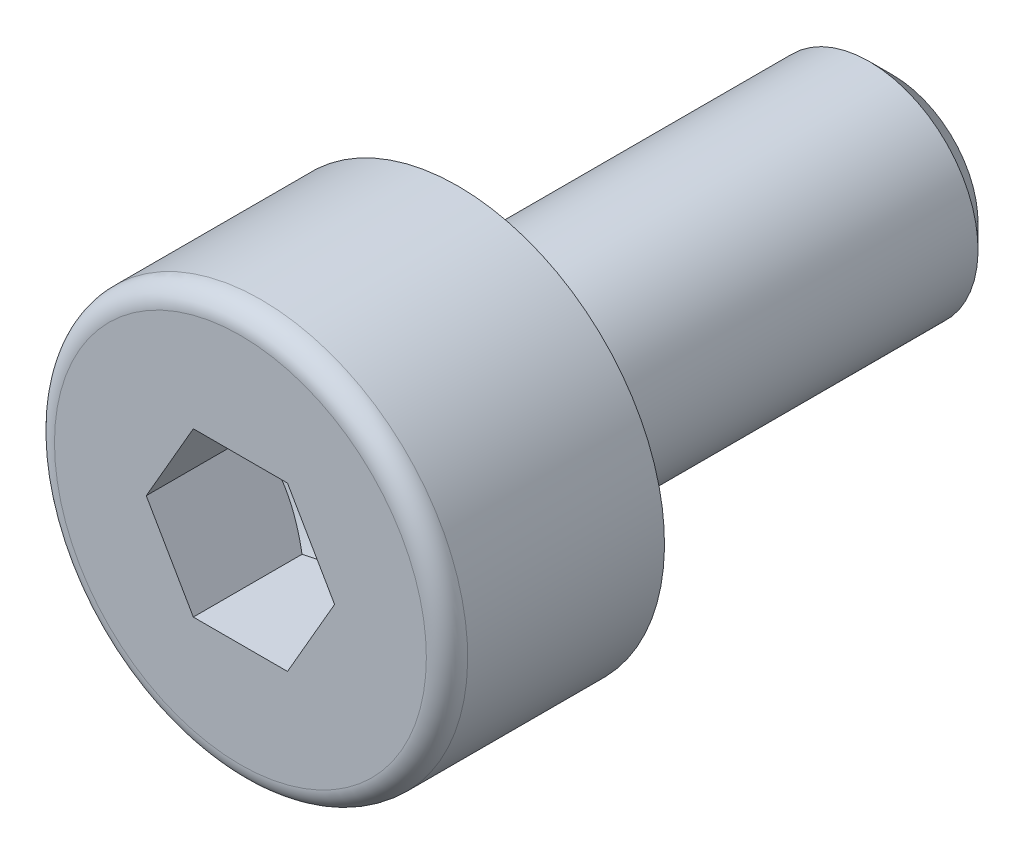
ISO-10303-21;
HEADER;
FILE_DESCRIPTION(('STEP AP214'),'2;1');
FILE_NAME('part.step','',(''),(''),'','','');
FILE_SCHEMA(('AUTOMOTIVE_DESIGN { 1 0 10303 214 1 1 1 1 }'));
ENDSEC;
DATA;
#1=APPLICATION_CONTEXT('core data for automotive mechanical design processes');
#2=APPLICATION_PROTOCOL_DEFINITION('international standard','automotive_design',2000,#1);
#3=PRODUCT_CONTEXT('',#1,'mechanical');
#4=PRODUCT('Part','Part','',(#3));
#5=PRODUCT_RELATED_PRODUCT_CATEGORY('part','',(#4));
#6=PRODUCT_DEFINITION_FORMATION('','',#4);
#7=PRODUCT_DEFINITION_CONTEXT('part definition',#1,'design');
#8=PRODUCT_DEFINITION('design','',#6,#7);
#9=PRODUCT_DEFINITION_SHAPE('','',#8);
#10=(LENGTH_UNIT() NAMED_UNIT(*) SI_UNIT(.MILLI.,.METRE.));
#11=(NAMED_UNIT(*) PLANE_ANGLE_UNIT() SI_UNIT($,.RADIAN.));
#12=(NAMED_UNIT(*) SI_UNIT($,.STERADIAN.) SOLID_ANGLE_UNIT());
#13=UNCERTAINTY_MEASURE_WITH_UNIT(LENGTH_MEASURE(1.E-05),#10,'distance_accuracy_value','');
#14=(GEOMETRIC_REPRESENTATION_CONTEXT(3) GLOBAL_UNCERTAINTY_ASSIGNED_CONTEXT((#13)) GLOBAL_UNIT_ASSIGNED_CONTEXT((#10,
#11,#12)) REPRESENTATION_CONTEXT('',''));
#15=CARTESIAN_POINT('',(0.,0.,0.));
#16=DIRECTION('',(0.,0.,1.));
#17=DIRECTION('',(1.,0.,0.));
#18=AXIS2_PLACEMENT_3D('',#15,#16,#17);
#19=CARTESIAN_POINT('',(0.,0.95,0.));
#20=DIRECTION('',(0.,0.,-1.));
#21=DIRECTION('',(0.,1.,0.));
#22=AXIS2_PLACEMENT_3D('',#19,#20,#21);
#23=PLANE('',#22);
#24=CARTESIAN_POINT('',(0.,0.,0.));
#25=DIRECTION('',(0.,0.,-1.));
#26=DIRECTION('',(0.,1.,0.));
#27=AXIS2_PLACEMENT_3D('',#24,#25,#26);
#28=CIRCLE('',#27,1.9);
#29=CARTESIAN_POINT('',(0.,1.9,0.));
#30=VERTEX_POINT('',#29);
#31=EDGE_CURVE('E11',#30,#30,#28,.T.);
#32=ORIENTED_EDGE('',*,*,#31,.T.);
#33=EDGE_LOOP('',(#32));
#34=FACE_BOUND('',#33,.T.);
#35=CARTESIAN_POINT('',(0.,0.,0.));
#36=DIRECTION('',(0.,0.,1.));
#37=DIRECTION('',(0.,1.,0.));
#38=AXIS2_PLACEMENT_3D('',#35,#36,#37);
#39=CIRCLE('',#38,1.);
#40=CARTESIAN_POINT('',(0.,-1.,0.));
#41=VERTEX_POINT('',#40);
#42=EDGE_CURVE('E83',#41,#41,#39,.T.);
#43=ORIENTED_EDGE('',*,*,#42,.T.);
#44=EDGE_LOOP('',(#43));
#45=FACE_BOUND('',#44,.T.);
#46=ADVANCED_FACE('F16',(#34,#45),#23,.T.);
#47=CARTESIAN_POINT('',(0.,0.,0.905));
#48=DIRECTION('',(0.,0.,1.));
#49=DIRECTION('',(0.,1.,0.));
#50=AXIS2_PLACEMENT_3D('',#47,#48,#49);
#51=CYLINDRICAL_SURFACE('',#50,1.9);
#52=CARTESIAN_POINT('',(0.,0.,1.81));
#53=DIRECTION('',(0.,0.,-1.));
#54=DIRECTION('',(0.,1.,0.));
#55=AXIS2_PLACEMENT_3D('',#52,#53,#54);
#56=CIRCLE('',#55,1.9);
#57=CARTESIAN_POINT('',(0.,1.9,1.81));
#58=VERTEX_POINT('',#57);
#59=EDGE_CURVE('E28',#58,#58,#56,.T.);
#60=ORIENTED_EDGE('',*,*,#59,.T.);
#61=EDGE_LOOP('',(#60));
#62=FACE_BOUND('',#61,.T.);
#63=ORIENTED_EDGE('',*,*,#31,.F.);
#64=EDGE_LOOP('',(#63));
#65=FACE_BOUND('',#64,.T.);
#66=ADVANCED_FACE('F209',(#62,#65),#51,.T.);
#67=CARTESIAN_POINT('',(0.,0.,1.81));
#68=DIRECTION('',(0.,0.,-1.));
#69=DIRECTION('',(-1.,0.,0.));
#70=AXIS2_PLACEMENT_3D('',#67,#68,#69);
#71=TOROIDAL_SURFACE('',#70,1.71,0.19);
#72=CARTESIAN_POINT('',(0.,0.,2.));
#73=DIRECTION('',(0.,0.,-1.));
#74=DIRECTION('',(0.,1.,0.));
#75=AXIS2_PLACEMENT_3D('',#72,#73,#74);
#76=CIRCLE('',#75,1.71);
#77=CARTESIAN_POINT('',(0.,1.71,2.));
#78=VERTEX_POINT('',#77);
#79=EDGE_CURVE('E75',#78,#78,#76,.T.);
#80=ORIENTED_EDGE('',*,*,#79,.T.);
#81=EDGE_LOOP('',(#80));
#82=FACE_BOUND('',#81,.T.);
#83=ORIENTED_EDGE('',*,*,#59,.F.);
#84=EDGE_LOOP('',(#83));
#85=FACE_BOUND('',#84,.T.);
#86=ADVANCED_FACE('F213',(#82,#85),#71,.T.);
#87=CARTESIAN_POINT('',(0.,0.855,2.));
#88=DIRECTION('',(0.,0.,1.));
#89=DIRECTION('',(0.,-1.,0.));
#90=AXIS2_PLACEMENT_3D('',#87,#88,#89);
#91=PLANE('',#90);
#92=ORIENTED_EDGE('',*,*,#79,.F.);
#93=EDGE_LOOP('',(#92));
#94=FACE_BOUND('',#93,.T.);
#95=DIRECTION('',(-0.5,0.866025403784439,0.));
#96=VECTOR('',#95,1.);
#97=CARTESIAN_POINT('',(-0.834631680058924,-0.0543748251562093,2.));
#98=LINE('',#97,#96);
#99=CARTESIAN_POINT('',(-0.4330125,-0.749999650312419,2.));
#100=VERTEX_POINT('',#99);
#101=CARTESIAN_POINT('',(-0.866025,0.,2.));
#102=VERTEX_POINT('',#101);
#103=EDGE_CURVE('E147',#100,#102,#98,.T.);
#104=ORIENTED_EDGE('',*,*,#103,.T.);
#105=DIRECTION('',(0.5,0.866025403784439,0.));
#106=VECTOR('',#105,1.);
#107=CARTESIAN_POINT('',(-0.464405819941077,0.695624825156209,2.));
#108=LINE('',#107,#106);
#109=CARTESIAN_POINT('',(-0.4330125,0.749999650312418,2.));
#110=VERTEX_POINT('',#109);
#111=EDGE_CURVE('E62',#102,#110,#108,.T.);
#112=ORIENTED_EDGE('',*,*,#111,.T.);
#113=DIRECTION('',(1.,0.,0.));
#114=VECTOR('',#113,1.);
#115=CARTESIAN_POINT('',(0.,0.749999650312419,2.));
#116=LINE('',#115,#114);
#117=CARTESIAN_POINT('',(0.4330125,0.749999650312419,2.));
#118=VERTEX_POINT('',#117);
#119=EDGE_CURVE('E67',#110,#118,#116,.T.);
#120=ORIENTED_EDGE('',*,*,#119,.T.);
#121=DIRECTION('',(0.5,-0.866025403784439,0.));
#122=VECTOR('',#121,1.);
#123=CARTESIAN_POINT('',(0.464405819941076,0.695624825156209,2.));
#124=LINE('',#123,#122);
#125=CARTESIAN_POINT('',(0.866025,0.,2.));
#126=VERTEX_POINT('',#125);
#127=EDGE_CURVE('E134',#118,#126,#124,.T.);
#128=ORIENTED_EDGE('',*,*,#127,.T.);
#129=DIRECTION('',(-0.5,-0.866025403784439,0.));
#130=VECTOR('',#129,1.);
#131=CARTESIAN_POINT('',(0.834631680058924,-0.0543748251562093,2.));
#132=LINE('',#131,#130);
#133=CARTESIAN_POINT('',(0.4330125,-0.749999650312419,2.));
#134=VERTEX_POINT('',#133);
#135=EDGE_CURVE('E113',#126,#134,#132,.T.);
#136=ORIENTED_EDGE('',*,*,#135,.T.);
#137=DIRECTION('',(-1.,0.,0.));
#138=VECTOR('',#137,1.);
#139=CARTESIAN_POINT('',(0.,-0.749999650312419,2.));
#140=LINE('',#139,#138);
#141=EDGE_CURVE('E110',#134,#100,#140,.T.);
#142=ORIENTED_EDGE('',*,*,#141,.T.);
#143=EDGE_LOOP('',(#104,#112,#120,#128,#136,#142));
#144=FACE_BOUND('',#143,.T.);
#145=ADVANCED_FACE('F184',(#94,#144),#91,.T.);
#146=CARTESIAN_POINT('',(0.,0.39175,-4.));
#147=DIRECTION('',(0.,0.,-1.));
#148=DIRECTION('',(0.,1.,0.));
#149=AXIS2_PLACEMENT_3D('',#146,#147,#148);
#150=PLANE('',#149);
#151=CARTESIAN_POINT('',(0.,0.,-4.));
#152=DIRECTION('',(0.,0.,-1.));
#153=DIRECTION('',(0.,1.,0.));
#154=AXIS2_PLACEMENT_3D('',#151,#152,#153);
#155=CIRCLE('',#154,0.7835);
#156=CARTESIAN_POINT('',(0.,0.7835,-4.));
#157=VERTEX_POINT('',#156);
#158=EDGE_CURVE('E79',#157,#157,#155,.T.);
#159=ORIENTED_EDGE('',*,*,#158,.T.);
#160=EDGE_LOOP('',(#159));
#161=FACE_BOUND('',#160,.T.);
#162=ADVANCED_FACE('F220',(#161),#150,.T.);
#163=CARTESIAN_POINT('',(0.,0.,-3.89175));
#164=DIRECTION('',(0.,0.,1.));
#165=DIRECTION('',(0.,1.,0.));
#166=AXIS2_PLACEMENT_3D('',#163,#164,#165);
#167=CONICAL_SURFACE('',#166,0.89175,0.785398163397449);
#168=CARTESIAN_POINT('',(0.,0.,-3.7835));
#169=DIRECTION('',(0.,0.,-1.));
#170=DIRECTION('',(0.,1.,0.));
#171=AXIS2_PLACEMENT_3D('',#168,#169,#170);
#172=CIRCLE('',#171,1.);
#173=CARTESIAN_POINT('',(0.,1.,-3.7835));
#174=VERTEX_POINT('',#173);
#175=EDGE_CURVE('E141',#174,#174,#172,.T.);
#176=ORIENTED_EDGE('',*,*,#175,.T.);
#177=EDGE_LOOP('',(#176));
#178=FACE_BOUND('',#177,.T.);
#179=ORIENTED_EDGE('',*,*,#158,.F.);
#180=EDGE_LOOP('',(#179));
#181=FACE_BOUND('',#180,.T.);
#182=ADVANCED_FACE('F18',(#178,#181),#167,.T.);
#183=CARTESIAN_POINT('',(0.,0.,-1.39175));
#184=DIRECTION('',(0.,0.,1.));
#185=DIRECTION('',(0.,1.,0.));
#186=AXIS2_PLACEMENT_3D('',#183,#184,#185);
#187=CYLINDRICAL_SURFACE('',#186,1.);
#188=ORIENTED_EDGE('',*,*,#42,.F.);
#189=EDGE_LOOP('',(#188));
#190=FACE_BOUND('',#189,.T.);
#191=ORIENTED_EDGE('',*,*,#175,.F.);
#192=EDGE_LOOP('',(#191));
#193=FACE_BOUND('',#192,.T.);
#194=ADVANCED_FACE('F216',(#190,#193),#187,.T.);
#195=CARTESIAN_POINT('',(-0.64951875,0.374999825156209,2.));
#196=DIRECTION('',(-0.866025403784439,0.5,0.));
#197=DIRECTION('',(0.5,0.866025403784439,0.));
#198=AXIS2_PLACEMENT_3D('',#195,#196,#197);
#199=PLANE('',#198);
#200=CARTESIAN_POINT('',(-0.866025,0.,1.));
#201=CARTESIAN_POINT('',(-0.64951875,0.374999825156208,0.875000058281262));
#202=CARTESIAN_POINT('',(-0.4330125,0.749999650312419,1.));
#203=(BOUNDED_CURVE() B_SPLINE_CURVE(2,(#200,#201,#202),.UNSPECIFIED.,.F.,
.F.) B_SPLINE_CURVE_WITH_KNOTS((3,3),(0.,0.876326694970832),
.UNSPECIFIED.) CURVE() GEOMETRIC_REPRESENTATION_ITEM() RATIONAL_B_SPLINE_CURVE((1.,
1.15470053837925,1.)) REPRESENTATION_ITEM(''));
#204=CARTESIAN_POINT('',(-0.866025,0.,1.));
#205=VERTEX_POINT('',#204);
#206=CARTESIAN_POINT('',(-0.4330125,0.749999650312418,1.));
#207=VERTEX_POINT('',#206);
#208=EDGE_CURVE('E128',#205,#207,#203,.T.);
#209=ORIENTED_EDGE('',*,*,#208,.T.);
#210=DIRECTION('',(0.,0.,-1.));
#211=VECTOR('',#210,1.);
#212=CARTESIAN_POINT('',(-0.4330125,0.749999650312418,2.));
#213=LINE('',#212,#211);
#214=EDGE_CURVE('E143',#110,#207,#213,.T.);
#215=ORIENTED_EDGE('',*,*,#214,.F.);
#216=ORIENTED_EDGE('',*,*,#111,.F.);
#217=DIRECTION('',(0.,0.,-1.));
#218=VECTOR('',#217,1.);
#219=CARTESIAN_POINT('',(-0.866025,0.,2.));
#220=LINE('',#219,#218);
#221=EDGE_CURVE('E122',#102,#205,#220,.T.);
#222=ORIENTED_EDGE('',*,*,#221,.T.);
#223=EDGE_LOOP('',(#209,#215,#216,#222));
#224=FACE_BOUND('',#223,.T.);
#225=ADVANCED_FACE('F190',(#224),#199,.F.);
#226=CARTESIAN_POINT('',(0.,0.749999650312418,2.));
#227=DIRECTION('',(0.,1.,0.));
#228=DIRECTION('',(1.,0.,0.));
#229=AXIS2_PLACEMENT_3D('',#226,#227,#228);
#230=PLANE('',#229);
#231=CARTESIAN_POINT('',(-0.4330125,0.749999650312418,1.));
#232=CARTESIAN_POINT('',(0.,0.749999650312417,0.875000058281262));
#233=CARTESIAN_POINT('',(0.4330125,0.749999650312419,1.));
#234=(BOUNDED_CURVE() B_SPLINE_CURVE(2,(#231,#232,#233),.UNSPECIFIED.,.F.,
.F.) B_SPLINE_CURVE_WITH_KNOTS((3,3),(0.,0.876326694970832),
.UNSPECIFIED.) CURVE() GEOMETRIC_REPRESENTATION_ITEM() RATIONAL_B_SPLINE_CURVE((1.,
1.15470053837925,1.)) REPRESENTATION_ITEM(''));
#235=CARTESIAN_POINT('',(0.4330125,0.749999650312419,1.));
#236=VERTEX_POINT('',#235);
#237=EDGE_CURVE('E154',#207,#236,#234,.T.);
#238=ORIENTED_EDGE('',*,*,#237,.T.);
#239=DIRECTION('',(0.,0.,-1.));
#240=VECTOR('',#239,1.);
#241=CARTESIAN_POINT('',(0.4330125,0.749999650312419,2.));
#242=LINE('',#241,#240);
#243=EDGE_CURVE('E139',#118,#236,#242,.T.);
#244=ORIENTED_EDGE('',*,*,#243,.F.);
#245=ORIENTED_EDGE('',*,*,#119,.F.);
#246=ORIENTED_EDGE('',*,*,#214,.T.);
#247=EDGE_LOOP('',(#238,#244,#245,#246));
#248=FACE_BOUND('',#247,.T.);
#249=ADVANCED_FACE('F193',(#248),#230,.F.);
#250=CARTESIAN_POINT('',(0.64951875,0.374999825156209,2.));
#251=DIRECTION('',(0.866025403784439,0.5,0.));
#252=DIRECTION('',(0.5,-0.866025403784439,0.));
#253=AXIS2_PLACEMENT_3D('',#250,#251,#252);
#254=PLANE('',#253);
#255=CARTESIAN_POINT('',(0.4330125,0.749999650312419,1.));
#256=CARTESIAN_POINT('',(0.64951875,0.374999825156209,0.875000058281264));
#257=CARTESIAN_POINT('',(0.866025,0.,1.));
#258=(BOUNDED_CURVE() B_SPLINE_CURVE(2,(#255,#256,#257),.UNSPECIFIED.,.F.,
.F.) B_SPLINE_CURVE_WITH_KNOTS((3,3),(0.,0.876326694970832),
.UNSPECIFIED.) CURVE() GEOMETRIC_REPRESENTATION_ITEM() RATIONAL_B_SPLINE_CURVE((1.,
1.15470053837925,1.)) REPRESENTATION_ITEM(''));
#259=CARTESIAN_POINT('',(0.866025,0.,1.));
#260=VERTEX_POINT('',#259);
#261=EDGE_CURVE('E158',#236,#260,#258,.T.);
#262=ORIENTED_EDGE('',*,*,#261,.T.);
#263=DIRECTION('',(0.,0.,-1.));
#264=VECTOR('',#263,1.);
#265=CARTESIAN_POINT('',(0.866025,0.,2.));
#266=LINE('',#265,#264);
#267=EDGE_CURVE('E118',#126,#260,#266,.T.);
#268=ORIENTED_EDGE('',*,*,#267,.F.);
#269=ORIENTED_EDGE('',*,*,#127,.F.);
#270=ORIENTED_EDGE('',*,*,#243,.T.);
#271=EDGE_LOOP('',(#262,#268,#269,#270));
#272=FACE_BOUND('',#271,.T.);
#273=ADVANCED_FACE('F196',(#272),#254,.F.);
#274=CARTESIAN_POINT('',(0.64951875,-0.374999825156209,2.));
#275=DIRECTION('',(0.866025403784439,-0.5,0.));
#276=DIRECTION('',(-0.5,-0.866025403784439,0.));
#277=AXIS2_PLACEMENT_3D('',#274,#275,#276);
#278=PLANE('',#277);
#279=CARTESIAN_POINT('',(0.866025,0.,1.));
#280=CARTESIAN_POINT('',(0.64951875,-0.37499982515621,0.875000058281264));
#281=CARTESIAN_POINT('',(0.4330125,-0.749999650312419,1.));
#282=(BOUNDED_CURVE() B_SPLINE_CURVE(2,(#279,#280,#281),.UNSPECIFIED.,.F.,
.F.) B_SPLINE_CURVE_WITH_KNOTS((3,3),(0.,0.876326694970831),
.UNSPECIFIED.) CURVE() GEOMETRIC_REPRESENTATION_ITEM() RATIONAL_B_SPLINE_CURVE((1.,
1.15470053837925,1.)) REPRESENTATION_ITEM(''));
#283=CARTESIAN_POINT('',(0.4330125,-0.749999650312419,1.));
#284=VERTEX_POINT('',#283);
#285=EDGE_CURVE('E20',#260,#284,#282,.T.);
#286=ORIENTED_EDGE('',*,*,#285,.T.);
#287=DIRECTION('',(0.,0.,-1.));
#288=VECTOR('',#287,1.);
#289=CARTESIAN_POINT('',(0.4330125,-0.749999650312419,2.));
#290=LINE('',#289,#288);
#291=EDGE_CURVE('E103',#134,#284,#290,.T.);
#292=ORIENTED_EDGE('',*,*,#291,.F.);
#293=ORIENTED_EDGE('',*,*,#135,.F.);
#294=ORIENTED_EDGE('',*,*,#267,.T.);
#295=EDGE_LOOP('',(#286,#292,#293,#294));
#296=FACE_BOUND('',#295,.T.);
#297=ADVANCED_FACE('F116',(#296),#278,.F.);
#298=CARTESIAN_POINT('',(0.,-0.749999650312419,2.));
#299=DIRECTION('',(0.,-1.,0.));
#300=DIRECTION('',(-1.,0.,0.));
#301=AXIS2_PLACEMENT_3D('',#298,#299,#300);
#302=PLANE('',#301);
#303=CARTESIAN_POINT('',(0.4330125,-0.749999650312419,1.));
#304=CARTESIAN_POINT('',(0.,-0.749999650312423,0.875000058281265));
#305=CARTESIAN_POINT('',(-0.4330125,-0.749999650312419,1.));
#306=(BOUNDED_CURVE() B_SPLINE_CURVE(2,(#303,#304,#305),.UNSPECIFIED.,.F.,
.F.) B_SPLINE_CURVE_WITH_KNOTS((3,3),(0.,0.876326694970832),
.UNSPECIFIED.) CURVE() GEOMETRIC_REPRESENTATION_ITEM() RATIONAL_B_SPLINE_CURVE((1.,
1.15470053837924,1.)) REPRESENTATION_ITEM(''));
#307=CARTESIAN_POINT('',(-0.4330125,-0.749999650312419,1.));
#308=VERTEX_POINT('',#307);
#309=EDGE_CURVE('E108',#284,#308,#306,.T.);
#310=ORIENTED_EDGE('',*,*,#309,.T.);
#311=DIRECTION('',(0.,0.,-1.));
#312=VECTOR('',#311,1.);
#313=CARTESIAN_POINT('',(-0.4330125,-0.749999650312419,2.));
#314=LINE('',#313,#312);
#315=EDGE_CURVE('E149',#100,#308,#314,.T.);
#316=ORIENTED_EDGE('',*,*,#315,.F.);
#317=ORIENTED_EDGE('',*,*,#141,.F.);
#318=ORIENTED_EDGE('',*,*,#291,.T.);
#319=EDGE_LOOP('',(#310,#316,#317,#318));
#320=FACE_BOUND('',#319,.T.);
#321=ADVANCED_FACE('F105',(#320),#302,.F.);
#322=CARTESIAN_POINT('',(-0.64951875,-0.374999825156209,2.));
#323=DIRECTION('',(-0.866025403784439,-0.5,0.));
#324=DIRECTION('',(-0.5,0.866025403784439,0.));
#325=AXIS2_PLACEMENT_3D('',#322,#323,#324);
#326=PLANE('',#325);
#327=CARTESIAN_POINT('',(-0.4330125,-0.749999650312419,1.));
#328=CARTESIAN_POINT('',(-0.64951875,-0.374999825156212,0.875000058281265));
#329=CARTESIAN_POINT('',(-0.866025,0.,1.));
#330=(BOUNDED_CURVE() B_SPLINE_CURVE(2,(#327,#328,#329),.UNSPECIFIED.,.F.,
.F.) B_SPLINE_CURVE_WITH_KNOTS((3,3),(0.,0.876326694970832),
.UNSPECIFIED.) CURVE() GEOMETRIC_REPRESENTATION_ITEM() RATIONAL_B_SPLINE_CURVE((1.,
1.15470053837924,1.)) REPRESENTATION_ITEM(''));
#331=EDGE_CURVE('E126',#308,#205,#330,.T.);
#332=ORIENTED_EDGE('',*,*,#331,.T.);
#333=ORIENTED_EDGE('',*,*,#221,.F.);
#334=ORIENTED_EDGE('',*,*,#103,.F.);
#335=ORIENTED_EDGE('',*,*,#315,.T.);
#336=EDGE_LOOP('',(#332,#333,#334,#335));
#337=FACE_BOUND('',#336,.T.);
#338=ADVANCED_FACE('F188',(#337),#326,.F.);
#339=CARTESIAN_POINT('',(0.,0.,0.750000116562527));
#340=DIRECTION('',(0.,0.,1.));
#341=DIRECTION('',(0.,1.,0.));
#342=AXIS2_PLACEMENT_3D('',#339,#340,#341);
#343=CONICAL_SURFACE('',#342,0.4330125,1.0471975511966);
#344=CARTESIAN_POINT('',(0.,0.,0.500000233125054));
#345=VERTEX_POINT('',#344);
#346=VERTEX_LOOP('',#345);
#347=FACE_BOUND('',#346,.T.);
#348=ORIENTED_EDGE('',*,*,#261,.F.);
#349=ORIENTED_EDGE('',*,*,#237,.F.);
#350=ORIENTED_EDGE('',*,*,#208,.F.);
#351=ORIENTED_EDGE('',*,*,#331,.F.);
#352=ORIENTED_EDGE('',*,*,#309,.F.);
#353=ORIENTED_EDGE('',*,*,#285,.F.);
#354=EDGE_LOOP('',(#348,#349,#350,#351,#352,#353));
#355=FACE_BOUND('',#354,.T.);
#356=ADVANCED_FACE('F123',(#347,#355),#343,.F.);
#357=CLOSED_SHELL('',(#46,#66,#86,#145,#162,#182,#194,#225,#249,#273,#297,#321,#338,#356));
#358=MANIFOLD_SOLID_BREP('B1',#357);
#359=ADVANCED_BREP_SHAPE_REPRESENTATION('',(#18,#358),#14);
#360=SHAPE_DEFINITION_REPRESENTATION(#9,#359);
ENDSEC;
END-ISO-10303-21;
